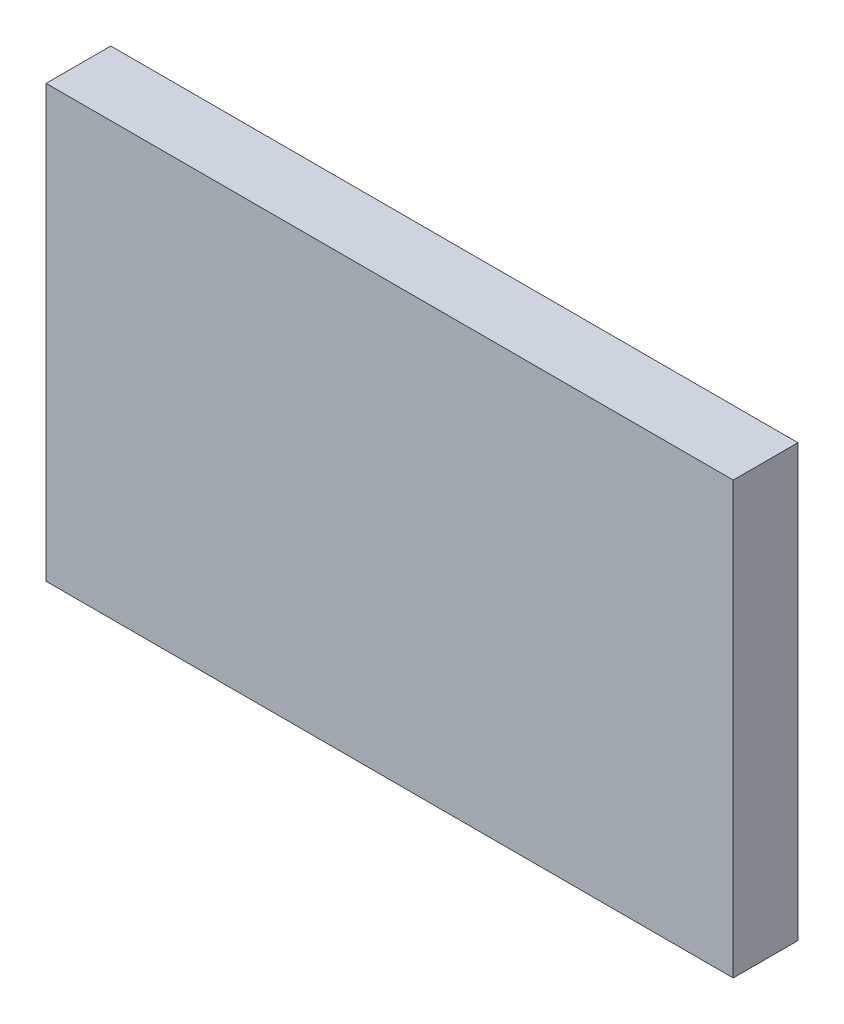
ISO-10303-21;
HEADER;
FILE_DESCRIPTION(('STEP AP214'),'2;1');
FILE_NAME('part.step','',(''),(''),'','','');
FILE_SCHEMA(('AUTOMOTIVE_DESIGN { 1 0 10303 214 1 1 1 1 }'));
ENDSEC;
DATA;
#1=APPLICATION_CONTEXT('core data for automotive mechanical design processes');
#2=APPLICATION_PROTOCOL_DEFINITION('international standard','automotive_design',2000,#1);
#3=PRODUCT_CONTEXT('',#1,'mechanical');
#4=PRODUCT('Part','Part','',(#3));
#5=PRODUCT_RELATED_PRODUCT_CATEGORY('part','',(#4));
#6=PRODUCT_DEFINITION_FORMATION('','',#4);
#7=PRODUCT_DEFINITION_CONTEXT('part definition',#1,'design');
#8=PRODUCT_DEFINITION('design','',#6,#7);
#9=PRODUCT_DEFINITION_SHAPE('','',#8);
#10=(LENGTH_UNIT() NAMED_UNIT(*) SI_UNIT(.MILLI.,.METRE.));
#11=(NAMED_UNIT(*) PLANE_ANGLE_UNIT() SI_UNIT($,.RADIAN.));
#12=(NAMED_UNIT(*) SI_UNIT($,.STERADIAN.) SOLID_ANGLE_UNIT());
#13=UNCERTAINTY_MEASURE_WITH_UNIT(LENGTH_MEASURE(1.E-05),#10,'distance_accuracy_value','');
#14=(GEOMETRIC_REPRESENTATION_CONTEXT(3) GLOBAL_UNCERTAINTY_ASSIGNED_CONTEXT((#13)) GLOBAL_UNIT_ASSIGNED_CONTEXT((#10,
#11,#12)) REPRESENTATION_CONTEXT('',''));
#15=CARTESIAN_POINT('',(0.,0.,0.));
#16=DIRECTION('',(0.,0.,1.));
#17=DIRECTION('',(1.,0.,0.));
#18=AXIS2_PLACEMENT_3D('',#15,#16,#17);
#19=CARTESIAN_POINT('',(-5.3623,-3.302,1.));
#20=DIRECTION('',(1.,0.,0.));
#21=DIRECTION('',(0.,0.,-1.));
#22=AXIS2_PLACEMENT_3D('',#19,#20,#21);
#23=PLANE('',#22);
#24=DIRECTION('',(0.,-1.,0.));
#25=VECTOR('',#24,1.);
#26=CARTESIAN_POINT('',(-5.3623,-3.302,0.));
#27=LINE('',#26,#25);
#28=CARTESIAN_POINT('',(-5.3623,3.3655,0.));
#29=VERTEX_POINT('',#28);
#30=CARTESIAN_POINT('',(-5.3623,-3.302,0.));
#31=VERTEX_POINT('',#30);
#32=EDGE_CURVE('E95',#29,#31,#27,.T.);
#33=ORIENTED_EDGE('',*,*,#32,.T.);
#34=DIRECTION('',(0.,0.,-1.));
#35=VECTOR('',#34,1.);
#36=CARTESIAN_POINT('',(-5.3623,-3.302,1.));
#37=LINE('',#36,#35);
#38=CARTESIAN_POINT('',(-5.3623,-3.302,1.));
#39=VERTEX_POINT('',#38);
#40=EDGE_CURVE('E11',#39,#31,#37,.T.);
#41=ORIENTED_EDGE('',*,*,#40,.F.);
#42=DIRECTION('',(0.,-1.,0.));
#43=VECTOR('',#42,1.);
#44=CARTESIAN_POINT('',(-5.3623,-3.302,1.));
#45=LINE('',#44,#43);
#46=CARTESIAN_POINT('',(-5.3623,3.3655,1.));
#47=VERTEX_POINT('',#46);
#48=EDGE_CURVE('E83',#47,#39,#45,.T.);
#49=ORIENTED_EDGE('',*,*,#48,.F.);
#50=DIRECTION('',(0.,0.,-1.));
#51=VECTOR('',#50,1.);
#52=CARTESIAN_POINT('',(-5.3623,3.3655,1.));
#53=LINE('',#52,#51);
#54=EDGE_CURVE('E91',#47,#29,#53,.T.);
#55=ORIENTED_EDGE('',*,*,#54,.T.);
#56=EDGE_LOOP('',(#33,#41,#49,#55));
#57=FACE_BOUND('',#56,.T.);
#58=ADVANCED_FACE('F32',(#57),#23,.F.);
#59=CARTESIAN_POINT('',(5.261556,-3.302,1.));
#60=DIRECTION('',(0.,1.,0.));
#61=DIRECTION('',(0.,0.,1.));
#62=AXIS2_PLACEMENT_3D('',#59,#60,#61);
#63=PLANE('',#62);
#64=DIRECTION('',(1.,0.,0.));
#65=VECTOR('',#64,1.);
#66=CARTESIAN_POINT('',(5.261556,-3.302,0.));
#67=LINE('',#66,#65);
#68=CARTESIAN_POINT('',(5.261556,-3.302,0.));
#69=VERTEX_POINT('',#68);
#70=EDGE_CURVE('E87',#31,#69,#67,.T.);
#71=ORIENTED_EDGE('',*,*,#70,.T.);
#72=DIRECTION('',(0.,0.,-1.));
#73=VECTOR('',#72,1.);
#74=CARTESIAN_POINT('',(5.261556,-3.302,1.));
#75=LINE('',#74,#73);
#76=CARTESIAN_POINT('',(5.261556,-3.302,1.));
#77=VERTEX_POINT('',#76);
#78=EDGE_CURVE('E40',#77,#69,#75,.T.);
#79=ORIENTED_EDGE('',*,*,#78,.F.);
#80=DIRECTION('',(1.,0.,0.));
#81=VECTOR('',#80,1.);
#82=CARTESIAN_POINT('',(5.261556,-3.302,1.));
#83=LINE('',#82,#81);
#84=EDGE_CURVE('E78',#39,#77,#83,.T.);
#85=ORIENTED_EDGE('',*,*,#84,.F.);
#86=ORIENTED_EDGE('',*,*,#40,.T.);
#87=EDGE_LOOP('',(#71,#79,#85,#86));
#88=FACE_BOUND('',#87,.T.);
#89=ADVANCED_FACE('F86',(#88),#63,.F.);
#90=CARTESIAN_POINT('',(5.261556,3.3655,1.));
#91=DIRECTION('',(-1.,0.,0.));
#92=DIRECTION('',(0.,0.,1.));
#93=AXIS2_PLACEMENT_3D('',#90,#91,#92);
#94=PLANE('',#93);
#95=DIRECTION('',(0.,1.,0.));
#96=VECTOR('',#95,1.);
#97=CARTESIAN_POINT('',(5.261556,3.3655,0.));
#98=LINE('',#97,#96);
#99=CARTESIAN_POINT('',(5.261556,3.3655,0.));
#100=VERTEX_POINT('',#99);
#101=EDGE_CURVE('E65',#69,#100,#98,.T.);
#102=ORIENTED_EDGE('',*,*,#101,.T.);
#103=DIRECTION('',(0.,0.,-1.));
#104=VECTOR('',#103,1.);
#105=CARTESIAN_POINT('',(5.261556,3.3655,1.));
#106=LINE('',#105,#104);
#107=CARTESIAN_POINT('',(5.261556,3.3655,1.));
#108=VERTEX_POINT('',#107);
#109=EDGE_CURVE('E88',#108,#100,#106,.T.);
#110=ORIENTED_EDGE('',*,*,#109,.F.);
#111=DIRECTION('',(0.,1.,0.));
#112=VECTOR('',#111,1.);
#113=CARTESIAN_POINT('',(5.261556,3.3655,1.));
#114=LINE('',#113,#112);
#115=EDGE_CURVE('E81',#77,#108,#114,.T.);
#116=ORIENTED_EDGE('',*,*,#115,.F.);
#117=ORIENTED_EDGE('',*,*,#78,.T.);
#118=EDGE_LOOP('',(#102,#110,#116,#117));
#119=FACE_BOUND('',#118,.T.);
#120=ADVANCED_FACE('F89',(#119),#94,.F.);
#121=CARTESIAN_POINT('',(-5.3623,3.3655,1.));
#122=DIRECTION('',(0.,-1.,0.));
#123=DIRECTION('',(0.,0.,-1.));
#124=AXIS2_PLACEMENT_3D('',#121,#122,#123);
#125=PLANE('',#124);
#126=DIRECTION('',(-1.,0.,0.));
#127=VECTOR('',#126,1.);
#128=CARTESIAN_POINT('',(-5.3623,3.3655,0.));
#129=LINE('',#128,#127);
#130=EDGE_CURVE('E71',#100,#29,#129,.T.);
#131=ORIENTED_EDGE('',*,*,#130,.T.);
#132=ORIENTED_EDGE('',*,*,#54,.F.);
#133=DIRECTION('',(-1.,0.,0.));
#134=VECTOR('',#133,1.);
#135=CARTESIAN_POINT('',(-5.3623,3.3655,1.));
#136=LINE('',#135,#134);
#137=EDGE_CURVE('E48',#108,#47,#136,.T.);
#138=ORIENTED_EDGE('',*,*,#137,.F.);
#139=ORIENTED_EDGE('',*,*,#109,.T.);
#140=EDGE_LOOP('',(#131,#132,#138,#139));
#141=FACE_BOUND('',#140,.T.);
#142=ADVANCED_FACE('F102',(#141),#125,.F.);
#143=CARTESIAN_POINT('',(0.,0.,1.));
#144=DIRECTION('',(0.,0.,-1.));
#145=DIRECTION('',(-1.,0.,0.));
#146=AXIS2_PLACEMENT_3D('',#143,#144,#145);
#147=PLANE('',#146);
#148=ORIENTED_EDGE('',*,*,#48,.T.);
#149=ORIENTED_EDGE('',*,*,#84,.T.);
#150=ORIENTED_EDGE('',*,*,#115,.T.);
#151=ORIENTED_EDGE('',*,*,#137,.T.);
#152=EDGE_LOOP('',(#148,#149,#150,#151));
#153=FACE_BOUND('',#152,.T.);
#154=ADVANCED_FACE('F79',(#153),#147,.F.);
#155=CARTESIAN_POINT('',(0.,0.,0.));
#156=DIRECTION('',(0.,0.,-1.));
#157=DIRECTION('',(-1.,0.,0.));
#158=AXIS2_PLACEMENT_3D('',#155,#156,#157);
#159=PLANE('',#158);
#160=ORIENTED_EDGE('',*,*,#32,.F.);
#161=ORIENTED_EDGE('',*,*,#130,.F.);
#162=ORIENTED_EDGE('',*,*,#101,.F.);
#163=ORIENTED_EDGE('',*,*,#70,.F.);
#164=EDGE_LOOP('',(#160,#161,#162,#163));
#165=FACE_BOUND('',#164,.T.);
#166=ADVANCED_FACE('F105',(#165),#159,.T.);
#167=CLOSED_SHELL('',(#58,#89,#120,#142,#154,#166));
#168=MANIFOLD_SOLID_BREP('B2',#167);
#169=ADVANCED_BREP_SHAPE_REPRESENTATION('',(#18,#168),#14);
#170=SHAPE_DEFINITION_REPRESENTATION(#9,#169);
ENDSEC;
END-ISO-10303-21;
